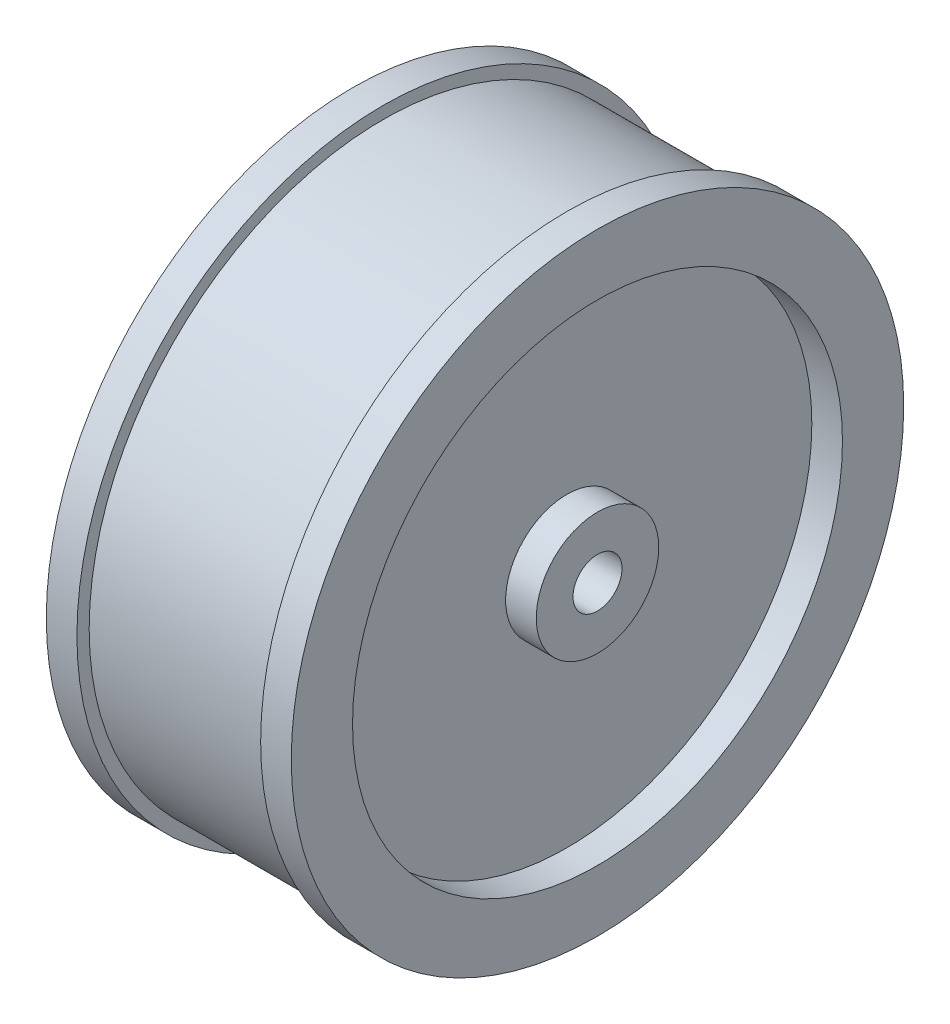
ISO-10303-21;
HEADER;
FILE_DESCRIPTION(('STEP AP214'),'2;1');
FILE_NAME('part.step','',(''),(''),'','','');
FILE_SCHEMA(('AUTOMOTIVE_DESIGN { 1 0 10303 214 1 1 1 1 }'));
ENDSEC;
DATA;
#1=APPLICATION_CONTEXT('core data for automotive mechanical design processes');
#2=APPLICATION_PROTOCOL_DEFINITION('international standard','automotive_design',2000,#1);
#3=PRODUCT_CONTEXT('',#1,'mechanical');
#4=PRODUCT('Part','Part','',(#3));
#5=PRODUCT_RELATED_PRODUCT_CATEGORY('part','',(#4));
#6=PRODUCT_DEFINITION_FORMATION('','',#4);
#7=PRODUCT_DEFINITION_CONTEXT('part definition',#1,'design');
#8=PRODUCT_DEFINITION('design','',#6,#7);
#9=PRODUCT_DEFINITION_SHAPE('','',#8);
#10=(LENGTH_UNIT() NAMED_UNIT(*) SI_UNIT(.MILLI.,.METRE.));
#11=(NAMED_UNIT(*) PLANE_ANGLE_UNIT() SI_UNIT($,.RADIAN.));
#12=(NAMED_UNIT(*) SI_UNIT($,.STERADIAN.) SOLID_ANGLE_UNIT());
#13=UNCERTAINTY_MEASURE_WITH_UNIT(LENGTH_MEASURE(1.E-05),#10,'distance_accuracy_value','');
#14=(GEOMETRIC_REPRESENTATION_CONTEXT(3) GLOBAL_UNCERTAINTY_ASSIGNED_CONTEXT((#13)) GLOBAL_UNIT_ASSIGNED_CONTEXT((#10,
#11,#12)) REPRESENTATION_CONTEXT('',''));
#15=CARTESIAN_POINT('',(0.,0.,0.));
#16=DIRECTION('',(0.,0.,1.));
#17=DIRECTION('',(1.,0.,0.));
#18=AXIS2_PLACEMENT_3D('',#15,#16,#17);
#19=CARTESIAN_POINT('',(0.,10.,0.));
#20=DIRECTION('',(1.,0.,0.));
#21=DIRECTION('',(0.,0.,-1.));
#22=AXIS2_PLACEMENT_3D('',#19,#20,#21);
#23=PLANE('',#22);
#24=CARTESIAN_POINT('',(0.,0.,0.));
#25=DIRECTION('',(1.,0.,0.));
#26=DIRECTION('',(0.,0.,-1.));
#27=AXIS2_PLACEMENT_3D('',#24,#25,#26);
#28=CIRCLE('',#27,10.);
#29=CARTESIAN_POINT('',(0.,0.,-10.));
#30=VERTEX_POINT('',#29);
#31=EDGE_CURVE('E93',#30,#30,#28,.T.);
#32=ORIENTED_EDGE('',*,*,#31,.T.);
#33=EDGE_LOOP('',(#32));
#34=FACE_BOUND('',#33,.T.);
#35=CARTESIAN_POINT('',(0.,0.,0.));
#36=DIRECTION('',(1.,0.,0.));
#37=DIRECTION('',(0.,0.,-1.));
#38=AXIS2_PLACEMENT_3D('',#35,#36,#37);
#39=CIRCLE('',#38,4.);
#40=CARTESIAN_POINT('',(0.,0.,-4.));
#41=VERTEX_POINT('',#40);
#42=EDGE_CURVE('E10',#41,#41,#39,.T.);
#43=ORIENTED_EDGE('',*,*,#42,.F.);
#44=EDGE_LOOP('',(#43));
#45=FACE_BOUND('',#44,.T.);
#46=ADVANCED_FACE('F41',(#34,#45),#23,.T.);
#47=CARTESIAN_POINT('',(0.,0.,0.));
#48=DIRECTION('',(1.,0.,0.));
#49=DIRECTION('',(0.,0.,-1.));
#50=AXIS2_PLACEMENT_3D('',#47,#48,#49);
#51=CYLINDRICAL_SURFACE('',#50,4.);
#52=ORIENTED_EDGE('',*,*,#42,.T.);
#53=EDGE_LOOP('',(#52));
#54=FACE_BOUND('',#53,.T.);
#55=CARTESIAN_POINT('',(-40.,0.,0.));
#56=DIRECTION('',(1.,0.,0.));
#57=DIRECTION('',(0.,0.,-1.));
#58=AXIS2_PLACEMENT_3D('',#55,#56,#57);
#59=CIRCLE('',#58,4.);
#60=CARTESIAN_POINT('',(-40.,0.,-4.));
#61=VERTEX_POINT('',#60);
#62=EDGE_CURVE('E47',#61,#61,#59,.T.);
#63=ORIENTED_EDGE('',*,*,#62,.F.);
#64=EDGE_LOOP('',(#63));
#65=FACE_BOUND('',#64,.T.);
#66=ADVANCED_FACE('F111',(#54,#65),#51,.F.);
#67=CARTESIAN_POINT('',(-40.,4.,0.));
#68=DIRECTION('',(-1.,0.,0.));
#69=DIRECTION('',(0.,0.,1.));
#70=AXIS2_PLACEMENT_3D('',#67,#68,#69);
#71=PLANE('',#70);
#72=ORIENTED_EDGE('',*,*,#62,.T.);
#73=EDGE_LOOP('',(#72));
#74=FACE_BOUND('',#73,.T.);
#75=CARTESIAN_POINT('',(-40.,0.,0.));
#76=DIRECTION('',(1.,0.,0.));
#77=DIRECTION('',(0.,0.,-1.));
#78=AXIS2_PLACEMENT_3D('',#75,#76,#77);
#79=CIRCLE('',#78,10.);
#80=CARTESIAN_POINT('',(-40.,0.,-10.));
#81=VERTEX_POINT('',#80);
#82=EDGE_CURVE('E51',#81,#81,#79,.T.);
#83=ORIENTED_EDGE('',*,*,#82,.F.);
#84=EDGE_LOOP('',(#83));
#85=FACE_BOUND('',#84,.T.);
#86=ADVANCED_FACE('F115',(#74,#85),#71,.T.);
#87=CARTESIAN_POINT('',(0.,0.,0.));
#88=DIRECTION('',(1.,0.,0.));
#89=DIRECTION('',(0.,0.,-1.));
#90=AXIS2_PLACEMENT_3D('',#87,#88,#89);
#91=CYLINDRICAL_SURFACE('',#90,10.);
#92=ORIENTED_EDGE('',*,*,#82,.T.);
#93=EDGE_LOOP('',(#92));
#94=FACE_BOUND('',#93,.T.);
#95=CARTESIAN_POINT('',(-35.,0.,0.));
#96=DIRECTION('',(1.,0.,0.));
#97=DIRECTION('',(0.,0.,-1.));
#98=AXIS2_PLACEMENT_3D('',#95,#96,#97);
#99=CIRCLE('',#98,10.);
#100=CARTESIAN_POINT('',(-35.,0.,-10.));
#101=VERTEX_POINT('',#100);
#102=EDGE_CURVE('E55',#101,#101,#99,.T.);
#103=ORIENTED_EDGE('',*,*,#102,.F.);
#104=EDGE_LOOP('',(#103));
#105=FACE_BOUND('',#104,.T.);
#106=ADVANCED_FACE('F119',(#94,#105),#91,.T.);
#107=CARTESIAN_POINT('',(-35.,10.,0.));
#108=DIRECTION('',(-1.,0.,0.));
#109=DIRECTION('',(0.,0.,1.));
#110=AXIS2_PLACEMENT_3D('',#107,#108,#109);
#111=PLANE('',#110);
#112=ORIENTED_EDGE('',*,*,#102,.T.);
#113=EDGE_LOOP('',(#112));
#114=FACE_BOUND('',#113,.T.);
#115=CARTESIAN_POINT('',(-35.,0.,0.));
#116=DIRECTION('',(1.,0.,0.));
#117=DIRECTION('',(0.,0.,-1.));
#118=AXIS2_PLACEMENT_3D('',#115,#116,#117);
#119=CIRCLE('',#118,40.);
#120=CARTESIAN_POINT('',(-35.,0.,-40.));
#121=VERTEX_POINT('',#120);
#122=EDGE_CURVE('E60',#121,#121,#119,.T.);
#123=ORIENTED_EDGE('',*,*,#122,.F.);
#124=EDGE_LOOP('',(#123));
#125=FACE_BOUND('',#124,.T.);
#126=ADVANCED_FACE('F125',(#114,#125),#111,.T.);
#127=CARTESIAN_POINT('',(0.,0.,0.));
#128=DIRECTION('',(1.,0.,0.));
#129=DIRECTION('',(0.,0.,-1.));
#130=AXIS2_PLACEMENT_3D('',#127,#128,#129);
#131=CYLINDRICAL_SURFACE('',#130,40.);
#132=ORIENTED_EDGE('',*,*,#122,.T.);
#133=EDGE_LOOP('',(#132));
#134=FACE_BOUND('',#133,.T.);
#135=CARTESIAN_POINT('',(-40.,0.,0.));
#136=DIRECTION('',(1.,0.,0.));
#137=DIRECTION('',(0.,0.,-1.));
#138=AXIS2_PLACEMENT_3D('',#135,#136,#137);
#139=CIRCLE('',#138,40.);
#140=CARTESIAN_POINT('',(-40.,0.,-40.));
#141=VERTEX_POINT('',#140);
#142=EDGE_CURVE('E63',#141,#141,#139,.T.);
#143=ORIENTED_EDGE('',*,*,#142,.F.);
#144=EDGE_LOOP('',(#143));
#145=FACE_BOUND('',#144,.T.);
#146=ADVANCED_FACE('F129',(#134,#145),#131,.F.);
#147=CARTESIAN_POINT('',(-40.,48.,0.));
#148=DIRECTION('',(-1.,0.,0.));
#149=DIRECTION('',(0.,0.,1.));
#150=AXIS2_PLACEMENT_3D('',#147,#148,#149);
#151=PLANE('',#150);
#152=ORIENTED_EDGE('',*,*,#142,.T.);
#153=EDGE_LOOP('',(#152));
#154=FACE_BOUND('',#153,.T.);
#155=CARTESIAN_POINT('',(-40.,0.,0.));
#156=DIRECTION('',(1.,0.,0.));
#157=DIRECTION('',(0.,0.,-1.));
#158=AXIS2_PLACEMENT_3D('',#155,#156,#157);
#159=CIRCLE('',#158,50.);
#160=CARTESIAN_POINT('',(-40.,0.,-50.));
#161=VERTEX_POINT('',#160);
#162=EDGE_CURVE('E66',#161,#161,#159,.T.);
#163=ORIENTED_EDGE('',*,*,#162,.F.);
#164=EDGE_LOOP('',(#163));
#165=FACE_BOUND('',#164,.T.);
#166=ADVANCED_FACE('F133',(#154,#165),#151,.T.);
#167=CARTESIAN_POINT('',(0.,0.,0.));
#168=DIRECTION('',(1.,0.,0.));
#169=DIRECTION('',(0.,0.,-1.));
#170=AXIS2_PLACEMENT_3D('',#167,#168,#169);
#171=CYLINDRICAL_SURFACE('',#170,50.);
#172=ORIENTED_EDGE('',*,*,#162,.T.);
#173=EDGE_LOOP('',(#172));
#174=FACE_BOUND('',#173,.T.);
#175=CARTESIAN_POINT('',(-35.,0.,0.));
#176=DIRECTION('',(1.,0.,0.));
#177=DIRECTION('',(0.,0.,-1.));
#178=AXIS2_PLACEMENT_3D('',#175,#176,#177);
#179=CIRCLE('',#178,50.);
#180=CARTESIAN_POINT('',(-35.,0.,-50.));
#181=VERTEX_POINT('',#180);
#182=EDGE_CURVE('E69',#181,#181,#179,.T.);
#183=ORIENTED_EDGE('',*,*,#182,.F.);
#184=EDGE_LOOP('',(#183));
#185=FACE_BOUND('',#184,.T.);
#186=ADVANCED_FACE('F137',(#174,#185),#171,.T.);
#187=CARTESIAN_POINT('',(-35.,48.,0.));
#188=DIRECTION('',(1.,0.,0.));
#189=DIRECTION('',(0.,0.,-1.));
#190=AXIS2_PLACEMENT_3D('',#187,#188,#189);
#191=PLANE('',#190);
#192=ORIENTED_EDGE('',*,*,#182,.T.);
#193=EDGE_LOOP('',(#192));
#194=FACE_BOUND('',#193,.T.);
#195=CARTESIAN_POINT('',(-35.,0.,0.));
#196=DIRECTION('',(1.,0.,0.));
#197=DIRECTION('',(0.,0.,-1.));
#198=AXIS2_PLACEMENT_3D('',#195,#196,#197);
#199=CIRCLE('',#198,48.);
#200=CARTESIAN_POINT('',(-35.,0.,-48.));
#201=VERTEX_POINT('',#200);
#202=EDGE_CURVE('E72',#201,#201,#199,.T.);
#203=ORIENTED_EDGE('',*,*,#202,.F.);
#204=EDGE_LOOP('',(#203));
#205=FACE_BOUND('',#204,.T.);
#206=ADVANCED_FACE('F141',(#194,#205),#191,.T.);
#207=CARTESIAN_POINT('',(0.,0.,0.));
#208=DIRECTION('',(1.,0.,0.));
#209=DIRECTION('',(0.,0.,-1.));
#210=AXIS2_PLACEMENT_3D('',#207,#208,#209);
#211=CYLINDRICAL_SURFACE('',#210,48.);
#212=ORIENTED_EDGE('',*,*,#202,.T.);
#213=EDGE_LOOP('',(#212));
#214=FACE_BOUND('',#213,.T.);
#215=CARTESIAN_POINT('',(-4.99999999999999,0.,0.));
#216=DIRECTION('',(1.,0.,0.));
#217=DIRECTION('',(0.,0.,-1.));
#218=AXIS2_PLACEMENT_3D('',#215,#216,#217);
#219=CIRCLE('',#218,48.);
#220=CARTESIAN_POINT('',(-4.99999999999999,0.,-48.));
#221=VERTEX_POINT('',#220);
#222=EDGE_CURVE('E75',#221,#221,#219,.T.);
#223=ORIENTED_EDGE('',*,*,#222,.F.);
#224=EDGE_LOOP('',(#223));
#225=FACE_BOUND('',#224,.T.);
#226=ADVANCED_FACE('F145',(#214,#225),#211,.T.);
#227=CARTESIAN_POINT('',(-4.99999999999999,48.,0.));
#228=DIRECTION('',(-1.,0.,0.));
#229=DIRECTION('',(0.,0.,1.));
#230=AXIS2_PLACEMENT_3D('',#227,#228,#229);
#231=PLANE('',#230);
#232=ORIENTED_EDGE('',*,*,#222,.T.);
#233=EDGE_LOOP('',(#232));
#234=FACE_BOUND('',#233,.T.);
#235=CARTESIAN_POINT('',(-4.99999999999999,0.,0.));
#236=DIRECTION('',(1.,0.,0.));
#237=DIRECTION('',(0.,0.,-1.));
#238=AXIS2_PLACEMENT_3D('',#235,#236,#237);
#239=CIRCLE('',#238,50.);
#240=CARTESIAN_POINT('',(-4.99999999999999,0.,-50.));
#241=VERTEX_POINT('',#240);
#242=EDGE_CURVE('E78',#241,#241,#239,.T.);
#243=ORIENTED_EDGE('',*,*,#242,.F.);
#244=EDGE_LOOP('',(#243));
#245=FACE_BOUND('',#244,.T.);
#246=ADVANCED_FACE('F149',(#234,#245),#231,.T.);
#247=CARTESIAN_POINT('',(0.,0.,0.));
#248=DIRECTION('',(1.,0.,0.));
#249=DIRECTION('',(0.,0.,-1.));
#250=AXIS2_PLACEMENT_3D('',#247,#248,#249);
#251=CYLINDRICAL_SURFACE('',#250,50.);
#252=ORIENTED_EDGE('',*,*,#242,.T.);
#253=EDGE_LOOP('',(#252));
#254=FACE_BOUND('',#253,.T.);
#255=CARTESIAN_POINT('',(0.,0.,0.));
#256=DIRECTION('',(1.,0.,0.));
#257=DIRECTION('',(0.,0.,-1.));
#258=AXIS2_PLACEMENT_3D('',#255,#256,#257);
#259=CIRCLE('',#258,50.);
#260=CARTESIAN_POINT('',(0.,0.,-50.));
#261=VERTEX_POINT('',#260);
#262=EDGE_CURVE('E81',#261,#261,#259,.T.);
#263=ORIENTED_EDGE('',*,*,#262,.F.);
#264=EDGE_LOOP('',(#263));
#265=FACE_BOUND('',#264,.T.);
#266=ADVANCED_FACE('F153',(#254,#265),#251,.T.);
#267=CARTESIAN_POINT('',(0.,40.,0.));
#268=DIRECTION('',(1.,0.,0.));
#269=DIRECTION('',(0.,0.,-1.));
#270=AXIS2_PLACEMENT_3D('',#267,#268,#269);
#271=PLANE('',#270);
#272=ORIENTED_EDGE('',*,*,#262,.T.);
#273=EDGE_LOOP('',(#272));
#274=FACE_BOUND('',#273,.T.);
#275=CARTESIAN_POINT('',(0.,0.,0.));
#276=DIRECTION('',(1.,0.,0.));
#277=DIRECTION('',(0.,0.,-1.));
#278=AXIS2_PLACEMENT_3D('',#275,#276,#277);
#279=CIRCLE('',#278,40.);
#280=CARTESIAN_POINT('',(0.,0.,-40.));
#281=VERTEX_POINT('',#280);
#282=EDGE_CURVE('E84',#281,#281,#279,.T.);
#283=ORIENTED_EDGE('',*,*,#282,.F.);
#284=EDGE_LOOP('',(#283));
#285=FACE_BOUND('',#284,.T.);
#286=ADVANCED_FACE('F157',(#274,#285),#271,.T.);
#287=CARTESIAN_POINT('',(0.,0.,0.));
#288=DIRECTION('',(1.,0.,0.));
#289=DIRECTION('',(0.,0.,-1.));
#290=AXIS2_PLACEMENT_3D('',#287,#288,#289);
#291=CYLINDRICAL_SURFACE('',#290,40.);
#292=ORIENTED_EDGE('',*,*,#282,.T.);
#293=EDGE_LOOP('',(#292));
#294=FACE_BOUND('',#293,.T.);
#295=CARTESIAN_POINT('',(-5.,0.,0.));
#296=DIRECTION('',(1.,0.,0.));
#297=DIRECTION('',(0.,0.,-1.));
#298=AXIS2_PLACEMENT_3D('',#295,#296,#297);
#299=CIRCLE('',#298,40.);
#300=CARTESIAN_POINT('',(-5.,0.,-40.));
#301=VERTEX_POINT('',#300);
#302=EDGE_CURVE('E87',#301,#301,#299,.T.);
#303=ORIENTED_EDGE('',*,*,#302,.F.);
#304=EDGE_LOOP('',(#303));
#305=FACE_BOUND('',#304,.T.);
#306=ADVANCED_FACE('F107',(#294,#305),#291,.F.);
#307=CARTESIAN_POINT('',(-5.,40.,0.));
#308=DIRECTION('',(1.,0.,0.));
#309=DIRECTION('',(0.,0.,-1.));
#310=AXIS2_PLACEMENT_3D('',#307,#308,#309);
#311=PLANE('',#310);
#312=ORIENTED_EDGE('',*,*,#302,.T.);
#313=EDGE_LOOP('',(#312));
#314=FACE_BOUND('',#313,.T.);
#315=CARTESIAN_POINT('',(-5.,0.,0.));
#316=DIRECTION('',(1.,0.,0.));
#317=DIRECTION('',(0.,0.,-1.));
#318=AXIS2_PLACEMENT_3D('',#315,#316,#317);
#319=CIRCLE('',#318,10.);
#320=CARTESIAN_POINT('',(-5.,0.,-10.));
#321=VERTEX_POINT('',#320);
#322=EDGE_CURVE('E90',#321,#321,#319,.T.);
#323=ORIENTED_EDGE('',*,*,#322,.F.);
#324=EDGE_LOOP('',(#323));
#325=FACE_BOUND('',#324,.T.);
#326=ADVANCED_FACE('F101',(#314,#325),#311,.T.);
#327=CARTESIAN_POINT('',(0.,0.,0.));
#328=DIRECTION('',(1.,0.,0.));
#329=DIRECTION('',(0.,0.,-1.));
#330=AXIS2_PLACEMENT_3D('',#327,#328,#329);
#331=CYLINDRICAL_SURFACE('',#330,10.);
#332=ORIENTED_EDGE('',*,*,#322,.T.);
#333=EDGE_LOOP('',(#332));
#334=FACE_BOUND('',#333,.T.);
#335=ORIENTED_EDGE('',*,*,#31,.F.);
#336=EDGE_LOOP('',(#335));
#337=FACE_BOUND('',#336,.T.);
#338=ADVANCED_FACE('F99',(#334,#337),#331,.T.);
#339=CLOSED_SHELL('',(#46,#66,#86,#106,#126,#146,#166,#186,#206,#226,#246,#266,#286,#306,#326,#338));
#340=MANIFOLD_SOLID_BREP('B2',#339);
#341=ADVANCED_BREP_SHAPE_REPRESENTATION('',(#18,#340),#14);
#342=SHAPE_DEFINITION_REPRESENTATION(#9,#341);
ENDSEC;
END-ISO-10303-21;
